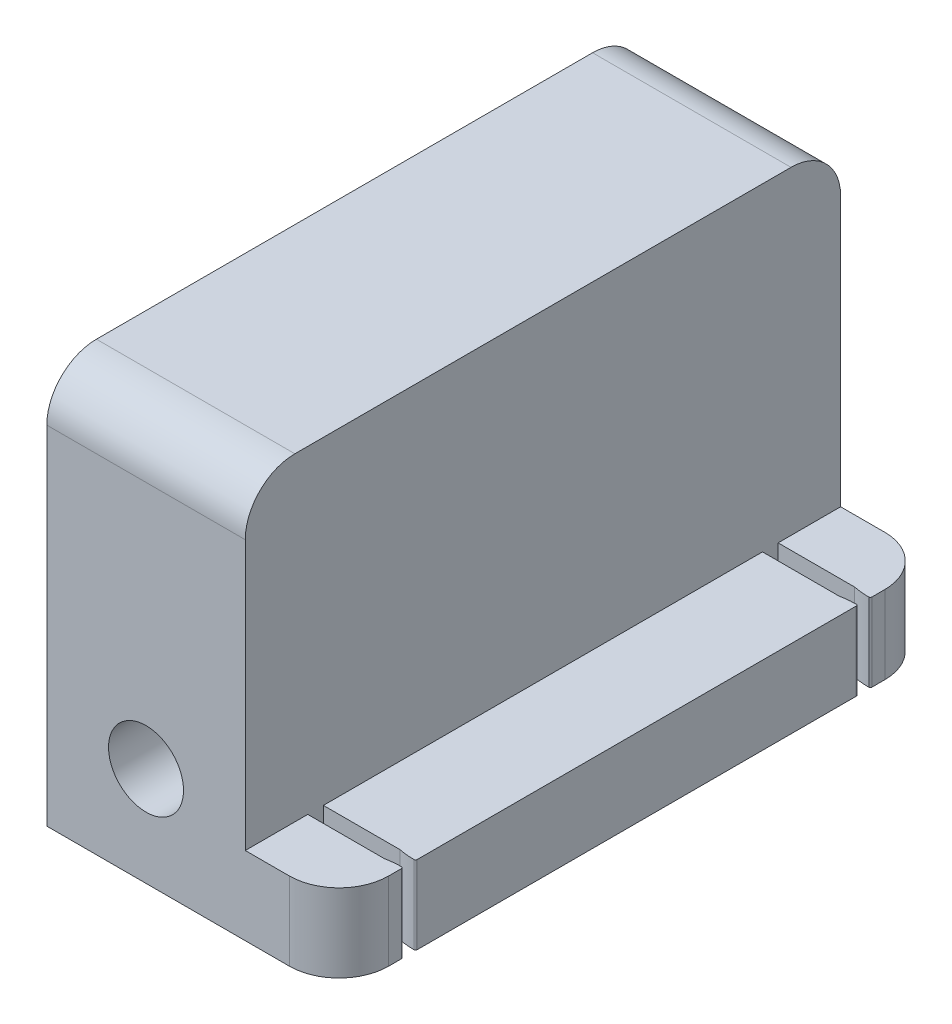
ISO-10303-21;
HEADER;
FILE_DESCRIPTION(('STEP AP214'),'2;1');
FILE_NAME('part.step','',(''),(''),'','','');
FILE_SCHEMA(('AUTOMOTIVE_DESIGN { 1 0 10303 214 1 1 1 1 }'));
ENDSEC;
DATA;
#1=APPLICATION_CONTEXT('core data for automotive mechanical design processes');
#2=APPLICATION_PROTOCOL_DEFINITION('international standard','automotive_design',2000,#1);
#3=PRODUCT_CONTEXT('',#1,'mechanical');
#4=PRODUCT('Part','Part','',(#3));
#5=PRODUCT_RELATED_PRODUCT_CATEGORY('part','',(#4));
#6=PRODUCT_DEFINITION_FORMATION('','',#4);
#7=PRODUCT_DEFINITION_CONTEXT('part definition',#1,'design');
#8=PRODUCT_DEFINITION('design','',#6,#7);
#9=PRODUCT_DEFINITION_SHAPE('','',#8);
#10=(LENGTH_UNIT() NAMED_UNIT(*) SI_UNIT(.MILLI.,.METRE.));
#11=(NAMED_UNIT(*) PLANE_ANGLE_UNIT() SI_UNIT($,.RADIAN.));
#12=(NAMED_UNIT(*) SI_UNIT($,.STERADIAN.) SOLID_ANGLE_UNIT());
#13=UNCERTAINTY_MEASURE_WITH_UNIT(LENGTH_MEASURE(1.E-05),#10,'distance_accuracy_value','');
#14=(GEOMETRIC_REPRESENTATION_CONTEXT(3) GLOBAL_UNCERTAINTY_ASSIGNED_CONTEXT((#13)) GLOBAL_UNIT_ASSIGNED_CONTEXT((#10,
#11,#12)) REPRESENTATION_CONTEXT('',''));
#15=CARTESIAN_POINT('',(0.,0.,0.));
#16=DIRECTION('',(0.,0.,1.));
#17=DIRECTION('',(1.,0.,0.));
#18=AXIS2_PLACEMENT_3D('',#15,#16,#17);
#19=CARTESIAN_POINT('',(-12.7,-25.4,38.1));
#20=DIRECTION('',(0.,1.,0.));
#21=DIRECTION('',(0.,0.,1.));
#22=AXIS2_PLACEMENT_3D('',#19,#20,#21);
#23=PLANE('',#22);
#24=DIRECTION('',(1.,0.,0.));
#25=VECTOR('',#24,1.);
#26=CARTESIAN_POINT('',(-12.7,-25.4,-38.1));
#27=LINE('',#26,#25);
#28=CARTESIAN_POINT('',(-12.7,-25.4,-38.1));
#29=VERTEX_POINT('',#28);
#30=CARTESIAN_POINT('',(18.35,-25.4,-38.1));
#31=VERTEX_POINT('',#30);
#32=EDGE_CURVE('E398',#29,#31,#27,.T.);
#33=ORIENTED_EDGE('',*,*,#32,.T.);
#34=CARTESIAN_POINT('',(18.35,-25.4,-31.75));
#35=DIRECTION('',(0.,1.,0.));
#36=DIRECTION('',(0.,0.,1.));
#37=AXIS2_PLACEMENT_3D('',#34,#35,#36);
#38=CIRCLE('',#37,6.35);
#39=CARTESIAN_POINT('',(24.7,-25.4,-31.75));
#40=VERTEX_POINT('',#39);
#41=EDGE_CURVE('E478',#31,#40,#38,.F.);
#42=ORIENTED_EDGE('',*,*,#41,.T.);
#43=DIRECTION('',(0.,0.,1.));
#44=VECTOR('',#43,1.);
#45=CARTESIAN_POINT('',(24.7,-25.4,38.1));
#46=LINE('',#45,#44);
#47=CARTESIAN_POINT('',(24.7,-25.4,-30.1));
#48=VERTEX_POINT('',#47);
#49=EDGE_CURVE('E365',#40,#48,#46,.T.);
#50=ORIENTED_EDGE('',*,*,#49,.T.);
#51=CARTESIAN_POINT('',(24.5,-25.4,-30.1));
#52=DIRECTION('',(0.,-1.,0.));
#53=DIRECTION('',(0.,0.,-1.));
#54=AXIS2_PLACEMENT_3D('',#51,#52,#53);
#55=CIRCLE('',#54,0.199999999999999);
#56=CARTESIAN_POINT('',(24.5,-25.4,-29.9));
#57=VERTEX_POINT('',#56);
#58=EDGE_CURVE('E240',#48,#57,#55,.T.);
#59=ORIENTED_EDGE('',*,*,#58,.T.);
#60=CARTESIAN_POINT('',(24.5,-25.4,-40.0000000000003));
#61=DIRECTION('',(0.,-1.,0.));
#62=DIRECTION('',(0.,0.,1.));
#63=AXIS2_PLACEMENT_3D('',#60,#61,#62);
#64=CIRCLE('',#63,10.1000000000003);
#65=CARTESIAN_POINT('',(22.5,-25.4,-30.1));
#66=VERTEX_POINT('',#65);
#67=EDGE_CURVE('E256',#57,#66,#64,.T.);
#68=ORIENTED_EDGE('',*,*,#67,.T.);
#69=DIRECTION('',(-1.,0.,0.));
#70=VECTOR('',#69,1.);
#71=CARTESIAN_POINT('',(22.5,-25.4,-30.1));
#72=LINE('',#71,#70);
#73=CARTESIAN_POINT('',(12.7,-25.4,-30.1));
#74=VERTEX_POINT('',#73);
#75=EDGE_CURVE('E260',#66,#74,#72,.T.);
#76=ORIENTED_EDGE('',*,*,#75,.T.);
#77=DIRECTION('',(0.,0.,1.));
#78=VECTOR('',#77,1.);
#79=CARTESIAN_POINT('',(12.7,-25.4,-30.1));
#80=LINE('',#79,#78);
#81=CARTESIAN_POINT('',(12.7,-25.4,-28.1));
#82=VERTEX_POINT('',#81);
#83=EDGE_CURVE('E264',#74,#82,#80,.T.);
#84=ORIENTED_EDGE('',*,*,#83,.T.);
#85=DIRECTION('',(1.,0.,0.));
#86=VECTOR('',#85,1.);
#87=CARTESIAN_POINT('',(12.7,-25.4,-28.1));
#88=LINE('',#87,#86);
#89=CARTESIAN_POINT('',(22.5,-25.4,-28.1));
#90=VERTEX_POINT('',#89);
#91=EDGE_CURVE('E230',#82,#90,#88,.T.);
#92=ORIENTED_EDGE('',*,*,#91,.T.);
#93=CARTESIAN_POINT('',(24.5,-25.4,-18.1999999999997));
#94=DIRECTION('',(0.,-1.,0.));
#95=DIRECTION('',(0.,0.,-1.));
#96=AXIS2_PLACEMENT_3D('',#93,#94,#95);
#97=CIRCLE('',#96,10.1000000000003);
#98=CARTESIAN_POINT('',(24.5,-25.4,-28.3));
#99=VERTEX_POINT('',#98);
#100=EDGE_CURVE('E222',#90,#99,#97,.T.);
#101=ORIENTED_EDGE('',*,*,#100,.T.);
#102=CARTESIAN_POINT('',(24.5,-25.4,-28.1));
#103=DIRECTION('',(0.,-1.,0.));
#104=DIRECTION('',(0.,0.,1.));
#105=AXIS2_PLACEMENT_3D('',#102,#103,#104);
#106=CIRCLE('',#105,0.199999999999999);
#107=CARTESIAN_POINT('',(24.7,-25.4,-28.1));
#108=VERTEX_POINT('',#107);
#109=EDGE_CURVE('E233',#99,#108,#106,.T.);
#110=ORIENTED_EDGE('',*,*,#109,.T.);
#111=CARTESIAN_POINT('',(24.7,-25.4,28.1));
#112=VERTEX_POINT('',#111);
#113=EDGE_CURVE('E368',#108,#112,#46,.T.);
#114=ORIENTED_EDGE('',*,*,#113,.T.);
#115=CARTESIAN_POINT('',(24.5,-25.4,28.1));
#116=DIRECTION('',(0.,-1.,0.));
#117=DIRECTION('',(0.,0.,-1.));
#118=AXIS2_PLACEMENT_3D('',#115,#116,#117);
#119=CIRCLE('',#118,0.199999999999999);
#120=CARTESIAN_POINT('',(24.5,-25.4,28.3));
#121=VERTEX_POINT('',#120);
#122=EDGE_CURVE('E339',#112,#121,#119,.T.);
#123=ORIENTED_EDGE('',*,*,#122,.T.);
#124=CARTESIAN_POINT('',(24.5,-25.4,18.1999999999996));
#125=DIRECTION('',(0.,-1.,0.));
#126=DIRECTION('',(0.,0.,1.));
#127=AXIS2_PLACEMENT_3D('',#124,#125,#126);
#128=CIRCLE('',#127,10.1000000000003);
#129=CARTESIAN_POINT('',(22.5,-25.4,28.1));
#130=VERTEX_POINT('',#129);
#131=EDGE_CURVE('E335',#121,#130,#128,.T.);
#132=ORIENTED_EDGE('',*,*,#131,.T.);
#133=DIRECTION('',(-1.,0.,0.));
#134=VECTOR('',#133,1.);
#135=CARTESIAN_POINT('',(12.7,-25.4,28.1));
#136=LINE('',#135,#134);
#137=CARTESIAN_POINT('',(12.7,-25.4,28.1));
#138=VERTEX_POINT('',#137);
#139=EDGE_CURVE('E331',#130,#138,#136,.T.);
#140=ORIENTED_EDGE('',*,*,#139,.T.);
#141=DIRECTION('',(0.,0.,1.));
#142=VECTOR('',#141,1.);
#143=CARTESIAN_POINT('',(12.7,-25.4,30.1));
#144=LINE('',#143,#142);
#145=CARTESIAN_POINT('',(12.7,-25.4,30.1));
#146=VERTEX_POINT('',#145);
#147=EDGE_CURVE('E327',#138,#146,#144,.T.);
#148=ORIENTED_EDGE('',*,*,#147,.T.);
#149=DIRECTION('',(1.,0.,0.));
#150=VECTOR('',#149,1.);
#151=CARTESIAN_POINT('',(22.5,-25.4,30.1));
#152=LINE('',#151,#150);
#153=CARTESIAN_POINT('',(22.5,-25.4,30.1));
#154=VERTEX_POINT('',#153);
#155=EDGE_CURVE('E297',#146,#154,#152,.T.);
#156=ORIENTED_EDGE('',*,*,#155,.T.);
#157=CARTESIAN_POINT('',(24.5,-25.4,40.0000000000003));
#158=DIRECTION('',(0.,-1.,0.));
#159=DIRECTION('',(0.,0.,-1.));
#160=AXIS2_PLACEMENT_3D('',#157,#158,#159);
#161=CIRCLE('',#160,10.1000000000003);
#162=CARTESIAN_POINT('',(24.5,-25.4,29.9));
#163=VERTEX_POINT('',#162);
#164=EDGE_CURVE('E246',#154,#163,#161,.T.);
#165=ORIENTED_EDGE('',*,*,#164,.T.);
#166=CARTESIAN_POINT('',(24.5,-25.4,30.1));
#167=DIRECTION('',(0.,-1.,0.));
#168=DIRECTION('',(0.,0.,1.));
#169=AXIS2_PLACEMENT_3D('',#166,#167,#168);
#170=CIRCLE('',#169,0.199999999999999);
#171=CARTESIAN_POINT('',(24.7,-25.4,30.1));
#172=VERTEX_POINT('',#171);
#173=EDGE_CURVE('E250',#163,#172,#170,.T.);
#174=ORIENTED_EDGE('',*,*,#173,.T.);
#175=CARTESIAN_POINT('',(24.7,-25.4,31.75));
#176=VERTEX_POINT('',#175);
#177=EDGE_CURVE('E272',#172,#176,#46,.T.);
#178=ORIENTED_EDGE('',*,*,#177,.T.);
#179=CARTESIAN_POINT('',(18.35,-25.4,31.75));
#180=DIRECTION('',(0.,1.,0.));
#181=DIRECTION('',(0.,0.,1.));
#182=AXIS2_PLACEMENT_3D('',#179,#180,#181);
#183=CIRCLE('',#182,6.35);
#184=CARTESIAN_POINT('',(18.35,-25.4,38.1));
#185=VERTEX_POINT('',#184);
#186=EDGE_CURVE('E475',#176,#185,#183,.F.);
#187=ORIENTED_EDGE('',*,*,#186,.T.);
#188=DIRECTION('',(1.,0.,0.));
#189=VECTOR('',#188,1.);
#190=CARTESIAN_POINT('',(-12.7,-25.4,38.1));
#191=LINE('',#190,#189);
#192=CARTESIAN_POINT('',(-12.7,-25.4,38.1));
#193=VERTEX_POINT('',#192);
#194=EDGE_CURVE('E401',#193,#185,#191,.T.);
#195=ORIENTED_EDGE('',*,*,#194,.F.);
#196=DIRECTION('',(0.,0.,-1.));
#197=VECTOR('',#196,1.);
#198=CARTESIAN_POINT('',(-12.7,-25.4,38.1));
#199=LINE('',#198,#197);
#200=EDGE_CURVE('E405',#193,#29,#199,.T.);
#201=ORIENTED_EDGE('',*,*,#200,.T.);
#202=EDGE_LOOP('',(#33,#42,#50,#59,#68,#76,#84,#92,#101,#110,#114,#123,#132,#140,#148,#156,#165,
#174,#178,#187,#195,#201));
#203=FACE_BOUND('',#202,.T.);
#204=ADVANCED_FACE('F43',(#203),#23,.F.);
#205=CARTESIAN_POINT('',(24.7,-15.4,38.1));
#206=DIRECTION('',(1.,0.,0.));
#207=DIRECTION('',(0.,0.,-1.));
#208=AXIS2_PLACEMENT_3D('',#205,#206,#207);
#209=PLANE('',#208);
#210=ORIENTED_EDGE('',*,*,#49,.F.);
#211=DIRECTION('',(0.,-1.,0.));
#212=VECTOR('',#211,1.);
#213=CARTESIAN_POINT('',(24.7,-15.4,-31.75));
#214=LINE('',#213,#212);
#215=CARTESIAN_POINT('',(24.7,-15.4,-31.75));
#216=VERTEX_POINT('',#215);
#217=EDGE_CURVE('E481',#40,#216,#214,.F.);
#218=ORIENTED_EDGE('',*,*,#217,.T.);
#219=DIRECTION('',(0.,0.,1.));
#220=VECTOR('',#219,1.);
#221=CARTESIAN_POINT('',(24.7,-15.4,38.1));
#222=LINE('',#221,#220);
#223=CARTESIAN_POINT('',(24.7,-15.4,-30.1));
#224=VERTEX_POINT('',#223);
#225=EDGE_CURVE('E346',#216,#224,#222,.T.);
#226=ORIENTED_EDGE('',*,*,#225,.T.);
#227=DIRECTION('',(0.,1.,0.));
#228=VECTOR('',#227,1.);
#229=CARTESIAN_POINT('',(24.7,-25.4,-30.1));
#230=LINE('',#229,#228);
#231=EDGE_CURVE('E288',#48,#224,#230,.T.);
#232=ORIENTED_EDGE('',*,*,#231,.F.);
#233=EDGE_LOOP('',(#210,#218,#226,#232));
#234=FACE_BOUND('',#233,.T.);
#235=ADVANCED_FACE('F599',(#234),#209,.T.);
#236=DIRECTION('',(0.,1.,0.));
#237=VECTOR('',#236,1.);
#238=CARTESIAN_POINT('',(24.7,-25.4,-28.1));
#239=LINE('',#238,#237);
#240=CARTESIAN_POINT('',(24.7,-15.4,-28.1));
#241=VERTEX_POINT('',#240);
#242=EDGE_CURVE('E229',#108,#241,#239,.T.);
#243=ORIENTED_EDGE('',*,*,#242,.T.);
#244=CARTESIAN_POINT('',(24.7,-15.4,28.1));
#245=VERTEX_POINT('',#244);
#246=EDGE_CURVE('E350',#241,#245,#222,.T.);
#247=ORIENTED_EDGE('',*,*,#246,.T.);
#248=DIRECTION('',(0.,1.,0.));
#249=VECTOR('',#248,1.);
#250=CARTESIAN_POINT('',(24.7,-25.4,28.1));
#251=LINE('',#250,#249);
#252=EDGE_CURVE('E302',#112,#245,#251,.T.);
#253=ORIENTED_EDGE('',*,*,#252,.F.);
#254=ORIENTED_EDGE('',*,*,#113,.F.);
#255=EDGE_LOOP('',(#243,#247,#253,#254));
#256=FACE_BOUND('',#255,.T.);
#257=ADVANCED_FACE('F560',(#256),#209,.T.);
#258=CARTESIAN_POINT('',(0.,-15.4,0.));
#259=DIRECTION('',(0.,-1.,0.));
#260=DIRECTION('',(0.,0.,-1.));
#261=AXIS2_PLACEMENT_3D('',#258,#259,#260);
#262=PLANE('',#261);
#263=ORIENTED_EDGE('',*,*,#225,.F.);
#264=CARTESIAN_POINT('',(18.35,-15.4,-31.75));
#265=DIRECTION('',(0.,-1.,0.));
#266=DIRECTION('',(0.,0.,-1.));
#267=AXIS2_PLACEMENT_3D('',#264,#265,#266);
#268=CIRCLE('',#267,6.35);
#269=CARTESIAN_POINT('',(18.35,-15.4,-38.1));
#270=VERTEX_POINT('',#269);
#271=EDGE_CURVE('E484',#216,#270,#268,.F.);
#272=ORIENTED_EDGE('',*,*,#271,.T.);
#273=DIRECTION('',(1.,0.,0.));
#274=VECTOR('',#273,1.);
#275=CARTESIAN_POINT('',(12.7,-15.4,-38.1));
#276=LINE('',#275,#274);
#277=CARTESIAN_POINT('',(12.7,-15.4,-38.1));
#278=VERTEX_POINT('',#277);
#279=EDGE_CURVE('E359',#278,#270,#276,.T.);
#280=ORIENTED_EDGE('',*,*,#279,.F.);
#281=DIRECTION('',(0.,0.,-1.));
#282=VECTOR('',#281,1.);
#283=CARTESIAN_POINT('',(12.7,-15.4,38.1));
#284=LINE('',#283,#282);
#285=CARTESIAN_POINT('',(12.7,-15.4,-30.1));
#286=VERTEX_POINT('',#285);
#287=EDGE_CURVE('E354',#286,#278,#284,.T.);
#288=ORIENTED_EDGE('',*,*,#287,.F.);
#289=DIRECTION('',(1.,0.,0.));
#290=VECTOR('',#289,1.);
#291=CARTESIAN_POINT('',(0.,-15.4,-30.1));
#292=LINE('',#291,#290);
#293=CARTESIAN_POINT('',(22.5,-15.4,-30.1));
#294=VERTEX_POINT('',#293);
#295=EDGE_CURVE('E464',#286,#294,#292,.T.);
#296=ORIENTED_EDGE('',*,*,#295,.T.);
#297=CARTESIAN_POINT('',(24.5,-15.4,-40.0000000000003));
#298=DIRECTION('',(0.,-1.,0.));
#299=DIRECTION('',(0.,0.,-1.));
#300=AXIS2_PLACEMENT_3D('',#297,#298,#299);
#301=CIRCLE('',#300,10.1000000000003);
#302=CARTESIAN_POINT('',(24.5,-15.4,-29.9));
#303=VERTEX_POINT('',#302);
#304=EDGE_CURVE('E460',#294,#303,#301,.F.);
#305=ORIENTED_EDGE('',*,*,#304,.T.);
#306=CARTESIAN_POINT('',(24.5,-15.4,-30.1));
#307=DIRECTION('',(0.,-1.,0.));
#308=DIRECTION('',(0.,0.,-1.));
#309=AXIS2_PLACEMENT_3D('',#306,#307,#308);
#310=CIRCLE('',#309,0.199999999999999);
#311=EDGE_CURVE('E456',#303,#224,#310,.F.);
#312=ORIENTED_EDGE('',*,*,#311,.T.);
#313=EDGE_LOOP('',(#263,#272,#280,#288,#296,#305,#312));
#314=FACE_BOUND('',#313,.T.);
#315=ADVANCED_FACE('F593',(#314),#262,.F.);
#316=CARTESIAN_POINT('',(24.5,-15.4,-18.1999999999997));
#317=DIRECTION('',(0.,-1.,0.));
#318=DIRECTION('',(0.,0.,-1.));
#319=AXIS2_PLACEMENT_3D('',#316,#317,#318);
#320=CIRCLE('',#319,10.1000000000003);
#321=CARTESIAN_POINT('',(24.5,-15.4,-28.3));
#322=VERTEX_POINT('',#321);
#323=CARTESIAN_POINT('',(22.5,-15.4,-28.1));
#324=VERTEX_POINT('',#323);
#325=EDGE_CURVE('E225',#322,#324,#320,.F.);
#326=ORIENTED_EDGE('',*,*,#325,.T.);
#327=DIRECTION('',(-1.,0.,0.));
#328=VECTOR('',#327,1.);
#329=CARTESIAN_POINT('',(0.,-15.4,-28.1));
#330=LINE('',#329,#328);
#331=CARTESIAN_POINT('',(12.7,-15.4,-28.1));
#332=VERTEX_POINT('',#331);
#333=EDGE_CURVE('E452',#324,#332,#330,.T.);
#334=ORIENTED_EDGE('',*,*,#333,.T.);
#335=CARTESIAN_POINT('',(12.7,-15.4,28.1));
#336=VERTEX_POINT('',#335);
#337=EDGE_CURVE('E360',#336,#332,#284,.T.);
#338=ORIENTED_EDGE('',*,*,#337,.F.);
#339=DIRECTION('',(1.,0.,0.));
#340=VECTOR('',#339,1.);
#341=CARTESIAN_POINT('',(0.,-15.4,28.1));
#342=LINE('',#341,#340);
#343=CARTESIAN_POINT('',(22.5,-15.4,28.1));
#344=VERTEX_POINT('',#343);
#345=EDGE_CURVE('E443',#336,#344,#342,.T.);
#346=ORIENTED_EDGE('',*,*,#345,.T.);
#347=CARTESIAN_POINT('',(24.5,-15.4,18.1999999999996));
#348=DIRECTION('',(0.,-1.,0.));
#349=DIRECTION('',(0.,0.,-1.));
#350=AXIS2_PLACEMENT_3D('',#347,#348,#349);
#351=CIRCLE('',#350,10.1000000000003);
#352=CARTESIAN_POINT('',(24.5,-15.4,28.3));
#353=VERTEX_POINT('',#352);
#354=EDGE_CURVE('E439',#344,#353,#351,.F.);
#355=ORIENTED_EDGE('',*,*,#354,.T.);
#356=CARTESIAN_POINT('',(24.5,-15.4,28.1));
#357=DIRECTION('',(0.,-1.,0.));
#358=DIRECTION('',(0.,0.,-1.));
#359=AXIS2_PLACEMENT_3D('',#356,#357,#358);
#360=CIRCLE('',#359,0.199999999999999);
#361=EDGE_CURVE('E435',#353,#245,#360,.F.);
#362=ORIENTED_EDGE('',*,*,#361,.T.);
#363=ORIENTED_EDGE('',*,*,#246,.F.);
#364=CARTESIAN_POINT('',(24.5,-15.4,-28.1));
#365=DIRECTION('',(0.,-1.,0.));
#366=DIRECTION('',(0.,0.,-1.));
#367=AXIS2_PLACEMENT_3D('',#364,#365,#366);
#368=CIRCLE('',#367,0.199999999999999);
#369=EDGE_CURVE('E447',#241,#322,#368,.F.);
#370=ORIENTED_EDGE('',*,*,#369,.T.);
#371=EDGE_LOOP('',(#326,#334,#338,#346,#355,#362,#363,#370));
#372=FACE_BOUND('',#371,.T.);
#373=ADVANCED_FACE('F562',(#372),#262,.F.);
#374=DIRECTION('',(-1.,0.,0.));
#375=VECTOR('',#374,1.);
#376=CARTESIAN_POINT('',(12.7,-15.4,38.1));
#377=LINE('',#376,#375);
#378=CARTESIAN_POINT('',(18.35,-15.4,38.1));
#379=VERTEX_POINT('',#378);
#380=CARTESIAN_POINT('',(12.7,-15.4,38.1));
#381=VERTEX_POINT('',#380);
#382=EDGE_CURVE('E349',#379,#381,#377,.T.);
#383=ORIENTED_EDGE('',*,*,#382,.F.);
#384=CARTESIAN_POINT('',(18.35,-15.4,31.75));
#385=DIRECTION('',(0.,-1.,0.));
#386=DIRECTION('',(0.,0.,-1.));
#387=AXIS2_PLACEMENT_3D('',#384,#385,#386);
#388=CIRCLE('',#387,6.35);
#389=CARTESIAN_POINT('',(24.7,-15.4,31.75));
#390=VERTEX_POINT('',#389);
#391=EDGE_CURVE('E498',#379,#390,#388,.F.);
#392=ORIENTED_EDGE('',*,*,#391,.T.);
#393=CARTESIAN_POINT('',(24.7,-15.4,30.1));
#394=VERTEX_POINT('',#393);
#395=EDGE_CURVE('E351',#394,#390,#222,.T.);
#396=ORIENTED_EDGE('',*,*,#395,.F.);
#397=CARTESIAN_POINT('',(24.5,-15.4,30.1));
#398=DIRECTION('',(0.,-1.,0.));
#399=DIRECTION('',(0.,0.,-1.));
#400=AXIS2_PLACEMENT_3D('',#397,#398,#399);
#401=CIRCLE('',#400,0.199999999999999);
#402=CARTESIAN_POINT('',(24.5,-15.4,29.9));
#403=VERTEX_POINT('',#402);
#404=EDGE_CURVE('E423',#394,#403,#401,.F.);
#405=ORIENTED_EDGE('',*,*,#404,.T.);
#406=CARTESIAN_POINT('',(24.5,-15.4,40.0000000000003));
#407=DIRECTION('',(0.,-1.,0.));
#408=DIRECTION('',(0.,0.,-1.));
#409=AXIS2_PLACEMENT_3D('',#406,#407,#408);
#410=CIRCLE('',#409,10.1000000000003);
#411=CARTESIAN_POINT('',(22.5,-15.4,30.1));
#412=VERTEX_POINT('',#411);
#413=EDGE_CURVE('E427',#403,#412,#410,.F.);
#414=ORIENTED_EDGE('',*,*,#413,.T.);
#415=DIRECTION('',(-1.,0.,0.));
#416=VECTOR('',#415,1.);
#417=CARTESIAN_POINT('',(0.,-15.4,30.1));
#418=LINE('',#417,#416);
#419=CARTESIAN_POINT('',(12.7,-15.4,30.1));
#420=VERTEX_POINT('',#419);
#421=EDGE_CURVE('E431',#412,#420,#418,.T.);
#422=ORIENTED_EDGE('',*,*,#421,.T.);
#423=EDGE_CURVE('E355',#381,#420,#284,.T.);
#424=ORIENTED_EDGE('',*,*,#423,.F.);
#425=EDGE_LOOP('',(#383,#392,#396,#405,#414,#422,#424));
#426=FACE_BOUND('',#425,.T.);
#427=ADVANCED_FACE('F550',(#426),#262,.F.);
#428=CARTESIAN_POINT('',(0.,0.,38.1));
#429=DIRECTION('',(0.,0.,-1.));
#430=DIRECTION('',(-1.,0.,0.));
#431=AXIS2_PLACEMENT_3D('',#428,#429,#430);
#432=PLANE('',#431);
#433=ORIENTED_EDGE('',*,*,#194,.T.);
#434=DIRECTION('',(0.,-1.,0.));
#435=VECTOR('',#434,1.);
#436=CARTESIAN_POINT('',(18.35,-15.4,38.1));
#437=LINE('',#436,#435);
#438=EDGE_CURVE('E495',#185,#379,#437,.F.);
#439=ORIENTED_EDGE('',*,*,#438,.T.);
#440=ORIENTED_EDGE('',*,*,#382,.T.);
#441=DIRECTION('',(0.,1.,0.));
#442=VECTOR('',#441,1.);
#443=CARTESIAN_POINT('',(12.7,-25.4,38.1));
#444=LINE('',#443,#442);
#445=CARTESIAN_POINT('',(12.7,19.05,38.1));
#446=VERTEX_POINT('',#445);
#447=EDGE_CURVE('E393',#381,#446,#444,.T.);
#448=ORIENTED_EDGE('',*,*,#447,.T.);
#449=DIRECTION('',(-1.,0.,0.));
#450=VECTOR('',#449,1.);
#451=CARTESIAN_POINT('',(0.,19.05,38.1));
#452=LINE('',#451,#450);
#453=CARTESIAN_POINT('',(-12.7,19.05,38.1));
#454=VERTEX_POINT('',#453);
#455=EDGE_CURVE('E491',#446,#454,#452,.T.);
#456=ORIENTED_EDGE('',*,*,#455,.T.);
#457=DIRECTION('',(0.,-1.,0.));
#458=VECTOR('',#457,1.);
#459=CARTESIAN_POINT('',(-12.7,-25.4,38.1));
#460=LINE('',#459,#458);
#461=EDGE_CURVE('E397',#454,#193,#460,.T.);
#462=ORIENTED_EDGE('',*,*,#461,.T.);
#463=EDGE_LOOP('',(#433,#439,#440,#448,#456,#462));
#464=FACE_BOUND('',#463,.T.);
#465=CARTESIAN_POINT('',(0.,-12.7,38.1));
#466=DIRECTION('',(0.,0.,1.));
#467=DIRECTION('',(1.,0.,0.));
#468=AXIS2_PLACEMENT_3D('',#465,#466,#467);
#469=CIRCLE('',#468,4.8006);
#470=CARTESIAN_POINT('',(-4.8006,-12.7,38.1));
#471=VERTEX_POINT('',#470);
#472=EDGE_CURVE('E385',#471,#471,#469,.T.);
#473=ORIENTED_EDGE('',*,*,#472,.F.);
#474=EDGE_LOOP('',(#473));
#475=FACE_BOUND('',#474,.T.);
#476=ADVANCED_FACE('F519',(#464,#475),#432,.F.);
#477=CARTESIAN_POINT('',(0.,0.,-38.1));
#478=DIRECTION('',(0.,0.,-1.));
#479=DIRECTION('',(-1.,0.,0.));
#480=AXIS2_PLACEMENT_3D('',#477,#478,#479);
#481=PLANE('',#480);
#482=ORIENTED_EDGE('',*,*,#279,.T.);
#483=DIRECTION('',(0.,-1.,0.));
#484=VECTOR('',#483,1.);
#485=CARTESIAN_POINT('',(18.35,0.,-38.1));
#486=LINE('',#485,#484);
#487=EDGE_CURVE('E471',#270,#31,#486,.T.);
#488=ORIENTED_EDGE('',*,*,#487,.T.);
#489=ORIENTED_EDGE('',*,*,#32,.F.);
#490=DIRECTION('',(0.,-1.,0.));
#491=VECTOR('',#490,1.);
#492=CARTESIAN_POINT('',(-12.7,-25.4,-38.1));
#493=LINE('',#492,#491);
#494=CARTESIAN_POINT('',(-12.7,19.05,-38.1));
#495=VERTEX_POINT('',#494);
#496=EDGE_CURVE('E408',#495,#29,#493,.T.);
#497=ORIENTED_EDGE('',*,*,#496,.F.);
#498=DIRECTION('',(-1.,0.,0.));
#499=VECTOR('',#498,1.);
#500=CARTESIAN_POINT('',(12.7,19.05,-38.1));
#501=LINE('',#500,#499);
#502=CARTESIAN_POINT('',(12.7,19.05,-38.1));
#503=VERTEX_POINT('',#502);
#504=EDGE_CURVE('E468',#495,#503,#501,.F.);
#505=ORIENTED_EDGE('',*,*,#504,.T.);
#506=DIRECTION('',(0.,1.,0.));
#507=VECTOR('',#506,1.);
#508=CARTESIAN_POINT('',(12.7,-25.4,-38.1));
#509=LINE('',#508,#507);
#510=EDGE_CURVE('E389',#278,#503,#509,.T.);
#511=ORIENTED_EDGE('',*,*,#510,.F.);
#512=EDGE_LOOP('',(#482,#488,#489,#497,#505,#511));
#513=FACE_BOUND('',#512,.T.);
#514=CARTESIAN_POINT('',(0.,-12.7,-38.1));
#515=DIRECTION('',(0.,0.,1.));
#516=DIRECTION('',(1.,0.,0.));
#517=AXIS2_PLACEMENT_3D('',#514,#515,#516);
#518=CIRCLE('',#517,4.8006);
#519=CARTESIAN_POINT('',(-4.8006,-12.7,-38.1));
#520=VERTEX_POINT('',#519);
#521=EDGE_CURVE('E373',#520,#520,#518,.T.);
#522=ORIENTED_EDGE('',*,*,#521,.T.);
#523=EDGE_LOOP('',(#522));
#524=FACE_BOUND('',#523,.T.);
#525=ADVANCED_FACE('F535',(#513,#524),#481,.T.);
#526=CARTESIAN_POINT('',(12.7,-25.4,38.1));
#527=DIRECTION('',(-1.,0.,0.));
#528=DIRECTION('',(0.,0.,1.));
#529=AXIS2_PLACEMENT_3D('',#526,#527,#528);
#530=PLANE('',#529);
#531=ORIENTED_EDGE('',*,*,#510,.T.);
#532=CARTESIAN_POINT('',(12.7,19.05,-31.75));
#533=DIRECTION('',(-1.,0.,0.));
#534=DIRECTION('',(0.,0.,1.));
#535=AXIS2_PLACEMENT_3D('',#532,#533,#534);
#536=CIRCLE('',#535,6.35);
#537=CARTESIAN_POINT('',(12.7,25.4,-31.75));
#538=VERTEX_POINT('',#537);
#539=EDGE_CURVE('E11',#503,#538,#536,.F.);
#540=ORIENTED_EDGE('',*,*,#539,.T.);
#541=DIRECTION('',(0.,0.,-1.));
#542=VECTOR('',#541,1.);
#543=CARTESIAN_POINT('',(12.7,25.4,38.1));
#544=LINE('',#543,#542);
#545=CARTESIAN_POINT('',(12.7,25.4,31.75));
#546=VERTEX_POINT('',#545);
#547=EDGE_CURVE('E420',#546,#538,#544,.T.);
#548=ORIENTED_EDGE('',*,*,#547,.F.);
#549=CARTESIAN_POINT('',(12.7,19.05,31.75));
#550=DIRECTION('',(-1.,0.,0.));
#551=DIRECTION('',(0.,0.,1.));
#552=AXIS2_PLACEMENT_3D('',#549,#550,#551);
#553=CIRCLE('',#552,6.35);
#554=EDGE_CURVE('E52',#546,#446,#553,.F.);
#555=ORIENTED_EDGE('',*,*,#554,.T.);
#556=ORIENTED_EDGE('',*,*,#447,.F.);
#557=ORIENTED_EDGE('',*,*,#423,.T.);
#558=DIRECTION('',(0.,1.,0.));
#559=VECTOR('',#558,1.);
#560=CARTESIAN_POINT('',(12.7,-25.4,30.1));
#561=LINE('',#560,#559);
#562=EDGE_CURVE('E317',#146,#420,#561,.T.);
#563=ORIENTED_EDGE('',*,*,#562,.F.);
#564=ORIENTED_EDGE('',*,*,#147,.F.);
#565=DIRECTION('',(0.,1.,0.));
#566=VECTOR('',#565,1.);
#567=CARTESIAN_POINT('',(12.7,-25.4,28.1));
#568=LINE('',#567,#566);
#569=EDGE_CURVE('E313',#138,#336,#568,.T.);
#570=ORIENTED_EDGE('',*,*,#569,.T.);
#571=ORIENTED_EDGE('',*,*,#337,.T.);
#572=DIRECTION('',(0.,1.,0.));
#573=VECTOR('',#572,1.);
#574=CARTESIAN_POINT('',(12.7,-25.4,-28.1));
#575=LINE('',#574,#573);
#576=EDGE_CURVE('E273',#82,#332,#575,.T.);
#577=ORIENTED_EDGE('',*,*,#576,.F.);
#578=ORIENTED_EDGE('',*,*,#83,.F.);
#579=DIRECTION('',(0.,1.,0.));
#580=VECTOR('',#579,1.);
#581=CARTESIAN_POINT('',(12.7,-25.4,-30.1));
#582=LINE('',#581,#580);
#583=EDGE_CURVE('E276',#74,#286,#582,.T.);
#584=ORIENTED_EDGE('',*,*,#583,.T.);
#585=ORIENTED_EDGE('',*,*,#287,.T.);
#586=EDGE_LOOP('',(#531,#540,#548,#555,#556,#557,#563,#564,#570,#571,#577,#578,#584,#585));
#587=FACE_BOUND('',#586,.T.);
#588=ADVANCED_FACE('F515',(#587),#530,.F.);
#589=CARTESIAN_POINT('',(-12.7,25.4,38.1));
#590=DIRECTION('',(0.,-1.,0.));
#591=DIRECTION('',(0.,0.,-1.));
#592=AXIS2_PLACEMENT_3D('',#589,#590,#591);
#593=PLANE('',#592);
#594=ORIENTED_EDGE('',*,*,#547,.T.);
#595=DIRECTION('',(-1.,0.,0.));
#596=VECTOR('',#595,1.);
#597=CARTESIAN_POINT('',(-12.7,25.4,-31.75));
#598=LINE('',#597,#596);
#599=CARTESIAN_POINT('',(-12.7,25.4,-31.75));
#600=VERTEX_POINT('',#599);
#601=EDGE_CURVE('E503',#538,#600,#598,.T.);
#602=ORIENTED_EDGE('',*,*,#601,.T.);
#603=DIRECTION('',(0.,0.,-1.));
#604=VECTOR('',#603,1.);
#605=CARTESIAN_POINT('',(-12.7,25.4,38.1));
#606=LINE('',#605,#604);
#607=CARTESIAN_POINT('',(-12.7,25.4,31.75));
#608=VERTEX_POINT('',#607);
#609=EDGE_CURVE('E416',#608,#600,#606,.T.);
#610=ORIENTED_EDGE('',*,*,#609,.F.);
#611=DIRECTION('',(-1.,0.,0.));
#612=VECTOR('',#611,1.);
#613=CARTESIAN_POINT('',(-12.7,25.4,31.75));
#614=LINE('',#613,#612);
#615=EDGE_CURVE('E64',#608,#546,#614,.F.);
#616=ORIENTED_EDGE('',*,*,#615,.T.);
#617=EDGE_LOOP('',(#594,#602,#610,#616));
#618=FACE_BOUND('',#617,.T.);
#619=ADVANCED_FACE('F527',(#618),#593,.F.);
#620=CARTESIAN_POINT('',(-12.7,-25.4,38.1));
#621=DIRECTION('',(1.,0.,0.));
#622=DIRECTION('',(0.,1.,0.));
#623=AXIS2_PLACEMENT_3D('',#620,#621,#622);
#624=PLANE('',#623);
#625=CARTESIAN_POINT('',(-12.7,12.7,25.4));
#626=DIRECTION('',(1.,0.,0.));
#627=DIRECTION('',(0.,0.,-1.));
#628=AXIS2_PLACEMENT_3D('',#625,#626,#627);
#629=CIRCLE('',#628,4.8006);
#630=CARTESIAN_POINT('',(-12.7,12.7,20.5994));
#631=VERTEX_POINT('',#630);
#632=EDGE_CURVE('E369',#631,#631,#629,.T.);
#633=ORIENTED_EDGE('',*,*,#632,.T.);
#634=EDGE_LOOP('',(#633));
#635=FACE_BOUND('',#634,.T.);
#636=CARTESIAN_POINT('',(-12.7,12.7,-25.4));
#637=DIRECTION('',(1.,0.,0.));
#638=DIRECTION('',(0.,0.,1.));
#639=AXIS2_PLACEMENT_3D('',#636,#637,#638);
#640=CIRCLE('',#639,4.8006);
#641=CARTESIAN_POINT('',(-12.7,12.7,-20.5994));
#642=VERTEX_POINT('',#641);
#643=EDGE_CURVE('E364',#642,#642,#640,.T.);
#644=ORIENTED_EDGE('',*,*,#643,.T.);
#645=EDGE_LOOP('',(#644));
#646=FACE_BOUND('',#645,.T.);
#647=ORIENTED_EDGE('',*,*,#609,.T.);
#648=CARTESIAN_POINT('',(-12.7,19.05,-31.75));
#649=DIRECTION('',(1.,0.,0.));
#650=DIRECTION('',(0.,1.,0.));
#651=AXIS2_PLACEMENT_3D('',#648,#649,#650);
#652=CIRCLE('',#651,6.35);
#653=EDGE_CURVE('E510',#600,#495,#652,.F.);
#654=ORIENTED_EDGE('',*,*,#653,.T.);
#655=ORIENTED_EDGE('',*,*,#496,.T.);
#656=ORIENTED_EDGE('',*,*,#200,.F.);
#657=ORIENTED_EDGE('',*,*,#461,.F.);
#658=CARTESIAN_POINT('',(-12.7,19.05,31.75));
#659=DIRECTION('',(1.,0.,0.));
#660=DIRECTION('',(0.,1.,0.));
#661=AXIS2_PLACEMENT_3D('',#658,#659,#660);
#662=CIRCLE('',#661,6.35);
#663=EDGE_CURVE('E507',#454,#608,#662,.F.);
#664=ORIENTED_EDGE('',*,*,#663,.T.);
#665=EDGE_LOOP('',(#647,#654,#655,#656,#657,#664));
#666=FACE_BOUND('',#665,.T.);
#667=ADVANCED_FACE('F525',(#635,#646,#666),#624,.F.);
#668=CARTESIAN_POINT('',(0.,-12.7,38.1));
#669=DIRECTION('',(0.,0.,-1.));
#670=DIRECTION('',(-1.,0.,0.));
#671=AXIS2_PLACEMENT_3D('',#668,#669,#670);
#672=CYLINDRICAL_SURFACE('',#671,4.8006);
#673=CARTESIAN_POINT('',(-4.8006,-12.7,38.1));
#674=CARTESIAN_POINT('',(-4.8006,-12.7,37.30625));
#675=CARTESIAN_POINT('',(-4.8006,-12.7,36.5125));
#676=CARTESIAN_POINT('',(-4.8006,-12.7,34.925));
#677=CARTESIAN_POINT('',(-4.8006,-12.7,34.13125));
#678=CARTESIAN_POINT('',(-4.8006,-12.7,32.54375));
#679=CARTESIAN_POINT('',(-4.8006,-12.7,31.75));
#680=CARTESIAN_POINT('',(-4.8006,-12.7,30.1625));
#681=CARTESIAN_POINT('',(-4.8006,-12.7,29.36875));
#682=CARTESIAN_POINT('',(-4.8006,-12.7,27.78125));
#683=CARTESIAN_POINT('',(-4.8006,-12.7,26.9875));
#684=CARTESIAN_POINT('',(-4.8006,-12.7,25.4));
#685=CARTESIAN_POINT('',(-4.8006,-12.7,24.60625));
#686=CARTESIAN_POINT('',(-4.8006,-12.7,23.01875));
#687=CARTESIAN_POINT('',(-4.8006,-12.7,22.225));
#688=CARTESIAN_POINT('',(-4.8006,-12.7,20.6375));
#689=CARTESIAN_POINT('',(-4.8006,-12.7,19.84375));
#690=CARTESIAN_POINT('',(-4.8006,-12.7,18.25625));
#691=CARTESIAN_POINT('',(-4.8006,-12.7,17.4625));
#692=CARTESIAN_POINT('',(-4.8006,-12.7,15.875));
#693=CARTESIAN_POINT('',(-4.8006,-12.7,15.08125));
#694=CARTESIAN_POINT('',(-4.8006,-12.7,13.49375));
#695=CARTESIAN_POINT('',(-4.8006,-12.7,12.7));
#696=CARTESIAN_POINT('',(-4.8006,-12.7,11.1125));
#697=CARTESIAN_POINT('',(-4.8006,-12.7,10.31875));
#698=CARTESIAN_POINT('',(-4.8006,-12.7,8.73124999999999));
#699=CARTESIAN_POINT('',(-4.8006,-12.7,7.93749999999999));
#700=CARTESIAN_POINT('',(-4.8006,-12.7,6.35));
#701=CARTESIAN_POINT('',(-4.8006,-12.7,5.55625));
#702=CARTESIAN_POINT('',(-4.8006,-12.7,3.96875));
#703=CARTESIAN_POINT('',(-4.8006,-12.7,3.175));
#704=CARTESIAN_POINT('',(-4.8006,-12.7,1.5875));
#705=CARTESIAN_POINT('',(-4.8006,-12.7,0.793750000000001));
#706=CARTESIAN_POINT('',(-4.8006,-12.7,-0.793750000000001));
#707=CARTESIAN_POINT('',(-4.8006,-12.7,-1.5875));
#708=CARTESIAN_POINT('',(-4.8006,-12.7,-3.175));
#709=CARTESIAN_POINT('',(-4.8006,-12.7,-3.96875));
#710=CARTESIAN_POINT('',(-4.8006,-12.7,-5.55625));
#711=CARTESIAN_POINT('',(-4.8006,-12.7,-6.35));
#712=CARTESIAN_POINT('',(-4.8006,-12.7,-7.93750000000001));
#713=CARTESIAN_POINT('',(-4.8006,-12.7,-8.73125));
#714=CARTESIAN_POINT('',(-4.8006,-12.7,-10.31875));
#715=CARTESIAN_POINT('',(-4.8006,-12.7,-11.1125));
#716=CARTESIAN_POINT('',(-4.8006,-12.7,-12.7));
#717=CARTESIAN_POINT('',(-4.8006,-12.7,-13.49375));
#718=CARTESIAN_POINT('',(-4.8006,-12.7,-15.08125));
#719=CARTESIAN_POINT('',(-4.8006,-12.7,-15.875));
#720=CARTESIAN_POINT('',(-4.8006,-12.7,-17.4625));
#721=CARTESIAN_POINT('',(-4.8006,-12.7,-18.25625));
#722=CARTESIAN_POINT('',(-4.8006,-12.7,-19.84375));
#723=CARTESIAN_POINT('',(-4.8006,-12.7,-20.6375));
#724=CARTESIAN_POINT('',(-4.8006,-12.7,-22.225));
#725=CARTESIAN_POINT('',(-4.8006,-12.7,-23.01875));
#726=CARTESIAN_POINT('',(-4.8006,-12.7,-24.60625));
#727=CARTESIAN_POINT('',(-4.8006,-12.7,-25.4));
#728=CARTESIAN_POINT('',(-4.8006,-12.7,-26.9875));
#729=CARTESIAN_POINT('',(-4.8006,-12.7,-27.78125));
#730=CARTESIAN_POINT('',(-4.8006,-12.7,-29.36875));
#731=CARTESIAN_POINT('',(-4.8006,-12.7,-30.1625));
#732=CARTESIAN_POINT('',(-4.8006,-12.7,-31.75));
#733=CARTESIAN_POINT('',(-4.8006,-12.7,-32.54375));
#734=CARTESIAN_POINT('',(-4.8006,-12.7,-34.13125));
#735=CARTESIAN_POINT('',(-4.8006,-12.7,-34.925));
#736=CARTESIAN_POINT('',(-4.8006,-12.7,-36.5125));
#737=CARTESIAN_POINT('',(-4.8006,-12.7,-37.30625));
#738=CARTESIAN_POINT('',(-4.8006,-12.7,-38.1));
#739=B_SPLINE_CURVE_WITH_KNOTS('',3,(#673,#674,#675,#676,#677,#678,#679,#680,#681,#682,#683,
#684,#685,#686,#687,#688,#689,#690,#691,#692,#693,#694,#695,#696,#697,#698,#699,#700,#701,#702,
#703,#704,#705,#706,#707,#708,#709,#710,#711,#712,#713,#714,#715,#716,#717,#718,#719,#720,#721,
#722,#723,#724,#725,#726,#727,#728,#729,#730,#731,#732,#733,#734,#735,#736,#737,#738),
.UNSPECIFIED.,.F.,.F.,(4,2,2,2,2,2,2,2,2,2,2,2,2,2,2,2,2,2,2,2,2,2,2,2,2,2,2,2,2,2,2,2,4),(0.,
2.38125,4.7625,7.14375,9.52500000000001,11.90625,14.2875,16.66875,19.05,21.43125,23.8125,
26.19375,28.575,30.95625,33.3375,35.71875,38.1,40.48125,42.8625,45.24375,47.625,50.00625,
52.3875,54.76875,57.15,59.53125,61.9125,64.29375,66.675,69.05625,71.4375,73.81875,76.2),.UNSPECIFIED.);
#740=EDGE_CURVE('BSEAM631',#471,#520,#739,.T.);
#741=ORIENTED_EDGE('',*,*,#472,.T.);
#742=ORIENTED_EDGE('',*,*,#521,.F.);
#743=ORIENTED_EDGE('',*,*,#740,.T.);
#744=ORIENTED_EDGE('',*,*,#740,.F.);
#745=EDGE_LOOP('',(#741,#743,#742,#744));
#746=FACE_BOUND('',#745,.T.);
#747=ADVANCED_FACE('F631',(#746),#672,.F.);
#748=CARTESIAN_POINT('',(-12.7,12.7,-25.4));
#749=DIRECTION('',(1.,0.,0.));
#750=DIRECTION('',(0.,0.,-1.));
#751=AXIS2_PLACEMENT_3D('',#748,#749,#750);
#752=CYLINDRICAL_SURFACE('',#751,4.8006);
#753=ORIENTED_EDGE('',*,*,#643,.F.);
#754=EDGE_LOOP('',(#753));
#755=FACE_BOUND('',#754,.T.);
#756=CARTESIAN_POINT('',(0.,12.7,-25.4));
#757=DIRECTION('',(1.,0.,0.));
#758=DIRECTION('',(0.,0.,1.));
#759=AXIS2_PLACEMENT_3D('',#756,#757,#758);
#760=CIRCLE('',#759,4.8006);
#761=CARTESIAN_POINT('',(0.,12.7,-20.5994));
#762=VERTEX_POINT('',#761);
#763=EDGE_CURVE('E378',#762,#762,#760,.T.);
#764=ORIENTED_EDGE('',*,*,#763,.T.);
#765=EDGE_LOOP('',(#764));
#766=FACE_BOUND('',#765,.T.);
#767=ADVANCED_FACE('F890',(#755,#766),#752,.F.);
#768=CARTESIAN_POINT('',(0.,12.7,-25.4));
#769=DIRECTION('',(-1.,0.,0.));
#770=DIRECTION('',(0.,0.,1.));
#771=AXIS2_PLACEMENT_3D('',#768,#769,#770);
#772=PLANE('',#771);
#773=ORIENTED_EDGE('',*,*,#763,.F.);
#774=EDGE_LOOP('',(#773));
#775=FACE_BOUND('',#774,.T.);
#776=ADVANCED_FACE('F879',(#775),#772,.T.);
#777=CARTESIAN_POINT('',(-12.7,12.7,25.4));
#778=DIRECTION('',(1.,0.,0.));
#779=DIRECTION('',(0.,0.,-1.));
#780=AXIS2_PLACEMENT_3D('',#777,#778,#779);
#781=CYLINDRICAL_SURFACE('',#780,4.8006);
#782=ORIENTED_EDGE('',*,*,#632,.F.);
#783=EDGE_LOOP('',(#782));
#784=FACE_BOUND('',#783,.T.);
#785=CARTESIAN_POINT('',(0.,12.7,25.4));
#786=DIRECTION('',(1.,0.,0.));
#787=DIRECTION('',(0.,0.,-1.));
#788=AXIS2_PLACEMENT_3D('',#785,#786,#787);
#789=CIRCLE('',#788,4.8006);
#790=CARTESIAN_POINT('',(0.,12.7,20.5994));
#791=VERTEX_POINT('',#790);
#792=EDGE_CURVE('E374',#791,#791,#789,.T.);
#793=ORIENTED_EDGE('',*,*,#792,.T.);
#794=EDGE_LOOP('',(#793));
#795=FACE_BOUND('',#794,.T.);
#796=ADVANCED_FACE('F868',(#784,#795),#781,.F.);
#797=CARTESIAN_POINT('',(0.,12.7,25.4));
#798=DIRECTION('',(1.,0.,0.));
#799=DIRECTION('',(0.,0.,-1.));
#800=AXIS2_PLACEMENT_3D('',#797,#798,#799);
#801=PLANE('',#800);
#802=ORIENTED_EDGE('',*,*,#792,.F.);
#803=EDGE_LOOP('',(#802));
#804=FACE_BOUND('',#803,.T.);
#805=ADVANCED_FACE('F677',(#804),#801,.F.);
#806=ORIENTED_EDGE('',*,*,#395,.T.);
#807=DIRECTION('',(0.,-1.,0.));
#808=VECTOR('',#807,1.);
#809=CARTESIAN_POINT('',(24.7,-25.4,31.75));
#810=LINE('',#809,#808);
#811=EDGE_CURVE('E487',#390,#176,#810,.T.);
#812=ORIENTED_EDGE('',*,*,#811,.T.);
#813=ORIENTED_EDGE('',*,*,#177,.F.);
#814=DIRECTION('',(0.,1.,0.));
#815=VECTOR('',#814,1.);
#816=CARTESIAN_POINT('',(24.7,-25.4,30.1));
#817=LINE('',#816,#815);
#818=EDGE_CURVE('E298',#172,#394,#817,.T.);
#819=ORIENTED_EDGE('',*,*,#818,.T.);
#820=EDGE_LOOP('',(#806,#812,#813,#819));
#821=FACE_BOUND('',#820,.T.);
#822=ADVANCED_FACE('F552',(#821),#209,.T.);
#823=CARTESIAN_POINT('',(24.5,-25.4,40.0000000000003));
#824=DIRECTION('',(0.,1.,0.));
#825=DIRECTION('',(0.,0.,1.));
#826=AXIS2_PLACEMENT_3D('',#823,#824,#825);
#827=CYLINDRICAL_SURFACE('',#826,10.1000000000003);
#828=DIRECTION('',(0.,1.,0.));
#829=VECTOR('',#828,1.);
#830=CARTESIAN_POINT('',(24.5,-25.4,29.9));
#831=LINE('',#830,#829);
#832=EDGE_CURVE('E294',#163,#403,#831,.T.);
#833=ORIENTED_EDGE('',*,*,#832,.F.);
#834=ORIENTED_EDGE('',*,*,#164,.F.);
#835=DIRECTION('',(0.,1.,0.));
#836=VECTOR('',#835,1.);
#837=CARTESIAN_POINT('',(22.5,-25.4,30.1));
#838=LINE('',#837,#836);
#839=EDGE_CURVE('E320',#154,#412,#838,.T.);
#840=ORIENTED_EDGE('',*,*,#839,.T.);
#841=ORIENTED_EDGE('',*,*,#413,.F.);
#842=EDGE_LOOP('',(#833,#834,#840,#841));
#843=FACE_BOUND('',#842,.T.);
#844=ADVANCED_FACE('F577',(#843),#827,.T.);
#845=CARTESIAN_POINT('',(22.5,-25.4,30.1));
#846=DIRECTION('',(0.,0.,1.));
#847=DIRECTION('',(1.,0.,0.));
#848=AXIS2_PLACEMENT_3D('',#845,#846,#847);
#849=PLANE('',#848);
#850=ORIENTED_EDGE('',*,*,#839,.F.);
#851=ORIENTED_EDGE('',*,*,#155,.F.);
#852=ORIENTED_EDGE('',*,*,#562,.T.);
#853=ORIENTED_EDGE('',*,*,#421,.F.);
#854=EDGE_LOOP('',(#850,#851,#852,#853));
#855=FACE_BOUND('',#854,.T.);
#856=ADVANCED_FACE('F580',(#855),#849,.F.);
#857=CARTESIAN_POINT('',(12.7,-25.4,28.1));
#858=DIRECTION('',(0.,0.,-1.));
#859=DIRECTION('',(-1.,0.,0.));
#860=AXIS2_PLACEMENT_3D('',#857,#858,#859);
#861=PLANE('',#860);
#862=ORIENTED_EDGE('',*,*,#569,.F.);
#863=ORIENTED_EDGE('',*,*,#139,.F.);
#864=DIRECTION('',(0.,1.,0.));
#865=VECTOR('',#864,1.);
#866=CARTESIAN_POINT('',(22.5,-25.4,28.1));
#867=LINE('',#866,#865);
#868=EDGE_CURVE('E309',#130,#344,#867,.T.);
#869=ORIENTED_EDGE('',*,*,#868,.T.);
#870=ORIENTED_EDGE('',*,*,#345,.F.);
#871=EDGE_LOOP('',(#862,#863,#869,#870));
#872=FACE_BOUND('',#871,.T.);
#873=ADVANCED_FACE('F585',(#872),#861,.F.);
#874=CARTESIAN_POINT('',(24.5,-25.4,18.1999999999996));
#875=DIRECTION('',(0.,1.,0.));
#876=DIRECTION('',(0.,0.,1.));
#877=AXIS2_PLACEMENT_3D('',#874,#875,#876);
#878=CYLINDRICAL_SURFACE('',#877,10.1000000000003);
#879=ORIENTED_EDGE('',*,*,#868,.F.);
#880=ORIENTED_EDGE('',*,*,#131,.F.);
#881=DIRECTION('',(0.,1.,0.));
#882=VECTOR('',#881,1.);
#883=CARTESIAN_POINT('',(24.5,-25.4,28.3));
#884=LINE('',#883,#882);
#885=EDGE_CURVE('E305',#121,#353,#884,.T.);
#886=ORIENTED_EDGE('',*,*,#885,.T.);
#887=ORIENTED_EDGE('',*,*,#354,.F.);
#888=EDGE_LOOP('',(#879,#880,#886,#887));
#889=FACE_BOUND('',#888,.T.);
#890=ADVANCED_FACE('F567',(#889),#878,.T.);
#891=CARTESIAN_POINT('',(24.5,-25.4,28.1));
#892=DIRECTION('',(0.,1.,0.));
#893=DIRECTION('',(0.,0.,1.));
#894=AXIS2_PLACEMENT_3D('',#891,#892,#893);
#895=CYLINDRICAL_SURFACE('',#894,0.199999999999999);
#896=ORIENTED_EDGE('',*,*,#885,.F.);
#897=ORIENTED_EDGE('',*,*,#122,.F.);
#898=ORIENTED_EDGE('',*,*,#252,.T.);
#899=ORIENTED_EDGE('',*,*,#361,.F.);
#900=EDGE_LOOP('',(#896,#897,#898,#899));
#901=FACE_BOUND('',#900,.T.);
#902=ADVANCED_FACE('F564',(#901),#895,.T.);
#903=CARTESIAN_POINT('',(24.5,-25.4,30.1));
#904=DIRECTION('',(0.,1.,0.));
#905=DIRECTION('',(0.,0.,1.));
#906=AXIS2_PLACEMENT_3D('',#903,#904,#905);
#907=CYLINDRICAL_SURFACE('',#906,0.199999999999999);
#908=ORIENTED_EDGE('',*,*,#818,.F.);
#909=ORIENTED_EDGE('',*,*,#173,.F.);
#910=ORIENTED_EDGE('',*,*,#832,.T.);
#911=ORIENTED_EDGE('',*,*,#404,.F.);
#912=EDGE_LOOP('',(#908,#909,#910,#911));
#913=FACE_BOUND('',#912,.T.);
#914=ADVANCED_FACE('F574',(#913),#907,.T.);
#915=CARTESIAN_POINT('',(24.5,-25.4,-18.1999999999997));
#916=DIRECTION('',(0.,1.,0.));
#917=DIRECTION('',(0.,0.,1.));
#918=AXIS2_PLACEMENT_3D('',#915,#916,#917);
#919=CYLINDRICAL_SURFACE('',#918,10.1000000000003);
#920=DIRECTION('',(0.,1.,0.));
#921=VECTOR('',#920,1.);
#922=CARTESIAN_POINT('',(24.5,-25.4,-28.3));
#923=LINE('',#922,#921);
#924=EDGE_CURVE('E217',#99,#322,#923,.T.);
#925=ORIENTED_EDGE('',*,*,#924,.F.);
#926=ORIENTED_EDGE('',*,*,#100,.F.);
#927=DIRECTION('',(0.,1.,0.));
#928=VECTOR('',#927,1.);
#929=CARTESIAN_POINT('',(22.5,-25.4,-28.1));
#930=LINE('',#929,#928);
#931=EDGE_CURVE('E269',#90,#324,#930,.T.);
#932=ORIENTED_EDGE('',*,*,#931,.T.);
#933=ORIENTED_EDGE('',*,*,#325,.F.);
#934=EDGE_LOOP('',(#925,#926,#932,#933));
#935=FACE_BOUND('',#934,.T.);
#936=ADVANCED_FACE('F219',(#935),#919,.T.);
#937=CARTESIAN_POINT('',(12.7,-25.4,-28.1));
#938=DIRECTION('',(0.,0.,1.));
#939=DIRECTION('',(1.,0.,0.));
#940=AXIS2_PLACEMENT_3D('',#937,#938,#939);
#941=PLANE('',#940);
#942=ORIENTED_EDGE('',*,*,#931,.F.);
#943=ORIENTED_EDGE('',*,*,#91,.F.);
#944=ORIENTED_EDGE('',*,*,#576,.T.);
#945=ORIENTED_EDGE('',*,*,#333,.F.);
#946=EDGE_LOOP('',(#942,#943,#944,#945));
#947=FACE_BOUND('',#946,.T.);
#948=ADVANCED_FACE('F611',(#947),#941,.F.);
#949=CARTESIAN_POINT('',(22.5,-25.4,-30.1));
#950=DIRECTION('',(0.,0.,-1.));
#951=DIRECTION('',(-1.,0.,0.));
#952=AXIS2_PLACEMENT_3D('',#949,#950,#951);
#953=PLANE('',#952);
#954=ORIENTED_EDGE('',*,*,#583,.F.);
#955=ORIENTED_EDGE('',*,*,#75,.F.);
#956=DIRECTION('',(0.,1.,0.));
#957=VECTOR('',#956,1.);
#958=CARTESIAN_POINT('',(22.5,-25.4,-30.1));
#959=LINE('',#958,#957);
#960=EDGE_CURVE('E280',#66,#294,#959,.T.);
#961=ORIENTED_EDGE('',*,*,#960,.T.);
#962=ORIENTED_EDGE('',*,*,#295,.F.);
#963=EDGE_LOOP('',(#954,#955,#961,#962));
#964=FACE_BOUND('',#963,.T.);
#965=ADVANCED_FACE('F609',(#964),#953,.F.);
#966=CARTESIAN_POINT('',(24.5,-25.4,-40.0000000000003));
#967=DIRECTION('',(0.,1.,0.));
#968=DIRECTION('',(0.,0.,1.));
#969=AXIS2_PLACEMENT_3D('',#966,#967,#968);
#970=CYLINDRICAL_SURFACE('',#969,10.1000000000003);
#971=ORIENTED_EDGE('',*,*,#960,.F.);
#972=ORIENTED_EDGE('',*,*,#67,.F.);
#973=DIRECTION('',(0.,1.,0.));
#974=VECTOR('',#973,1.);
#975=CARTESIAN_POINT('',(24.5,-25.4,-29.9));
#976=LINE('',#975,#974);
#977=EDGE_CURVE('E284',#57,#303,#976,.T.);
#978=ORIENTED_EDGE('',*,*,#977,.T.);
#979=ORIENTED_EDGE('',*,*,#304,.F.);
#980=EDGE_LOOP('',(#971,#972,#978,#979));
#981=FACE_BOUND('',#980,.T.);
#982=ADVANCED_FACE('F606',(#981),#970,.T.);
#983=CARTESIAN_POINT('',(24.5,-25.4,-30.1));
#984=DIRECTION('',(0.,1.,0.));
#985=DIRECTION('',(0.,0.,1.));
#986=AXIS2_PLACEMENT_3D('',#983,#984,#985);
#987=CYLINDRICAL_SURFACE('',#986,0.199999999999999);
#988=ORIENTED_EDGE('',*,*,#977,.F.);
#989=ORIENTED_EDGE('',*,*,#58,.F.);
#990=ORIENTED_EDGE('',*,*,#231,.T.);
#991=ORIENTED_EDGE('',*,*,#311,.F.);
#992=EDGE_LOOP('',(#988,#989,#990,#991));
#993=FACE_BOUND('',#992,.T.);
#994=ADVANCED_FACE('F602',(#993),#987,.T.);
#995=CARTESIAN_POINT('',(24.5,-25.4,-28.1));
#996=DIRECTION('',(0.,1.,0.));
#997=DIRECTION('',(0.,0.,1.));
#998=AXIS2_PLACEMENT_3D('',#995,#996,#997);
#999=CYLINDRICAL_SURFACE('',#998,0.199999999999999);
#1000=ORIENTED_EDGE('',*,*,#242,.F.);
#1001=ORIENTED_EDGE('',*,*,#109,.F.);
#1002=ORIENTED_EDGE('',*,*,#924,.T.);
#1003=ORIENTED_EDGE('',*,*,#369,.F.);
#1004=EDGE_LOOP('',(#1000,#1001,#1002,#1003));
#1005=FACE_BOUND('',#1004,.T.);
#1006=ADVANCED_FACE('F234',(#1005),#999,.T.);
#1007=CARTESIAN_POINT('',(18.35,0.,-31.75));
#1008=DIRECTION('',(0.,-1.,0.));
#1009=DIRECTION('',(0.,0.,-1.));
#1010=AXIS2_PLACEMENT_3D('',#1007,#1008,#1009);
#1011=CYLINDRICAL_SURFACE('',#1010,6.35);
#1012=ORIENTED_EDGE('',*,*,#271,.F.);
#1013=ORIENTED_EDGE('',*,*,#217,.F.);
#1014=ORIENTED_EDGE('',*,*,#41,.F.);
#1015=ORIENTED_EDGE('',*,*,#487,.F.);
#1016=EDGE_LOOP('',(#1012,#1013,#1014,#1015));
#1017=FACE_BOUND('',#1016,.T.);
#1018=ADVANCED_FACE('F596',(#1017),#1011,.T.);
#1019=CARTESIAN_POINT('',(18.35,-15.4,31.75));
#1020=DIRECTION('',(0.,1.,0.));
#1021=DIRECTION('',(0.,0.,1.));
#1022=AXIS2_PLACEMENT_3D('',#1019,#1020,#1021);
#1023=CYLINDRICAL_SURFACE('',#1022,6.35);
#1024=ORIENTED_EDGE('',*,*,#391,.F.);
#1025=ORIENTED_EDGE('',*,*,#438,.F.);
#1026=ORIENTED_EDGE('',*,*,#186,.F.);
#1027=ORIENTED_EDGE('',*,*,#811,.F.);
#1028=EDGE_LOOP('',(#1024,#1025,#1026,#1027));
#1029=FACE_BOUND('',#1028,.T.);
#1030=ADVANCED_FACE('F545',(#1029),#1023,.T.);
#1031=CARTESIAN_POINT('',(-12.7,19.05,-31.75));
#1032=DIRECTION('',(1.,0.,0.));
#1033=DIRECTION('',(0.,0.,-1.));
#1034=AXIS2_PLACEMENT_3D('',#1031,#1032,#1033);
#1035=CYLINDRICAL_SURFACE('',#1034,6.35);
#1036=ORIENTED_EDGE('',*,*,#539,.F.);
#1037=ORIENTED_EDGE('',*,*,#504,.F.);
#1038=ORIENTED_EDGE('',*,*,#653,.F.);
#1039=ORIENTED_EDGE('',*,*,#601,.F.);
#1040=EDGE_LOOP('',(#1036,#1037,#1038,#1039));
#1041=FACE_BOUND('',#1040,.T.);
#1042=ADVANCED_FACE('F530',(#1041),#1035,.T.);
#1043=CARTESIAN_POINT('',(0.,19.05,31.75));
#1044=DIRECTION('',(-1.,0.,0.));
#1045=DIRECTION('',(0.,0.,1.));
#1046=AXIS2_PLACEMENT_3D('',#1043,#1044,#1045);
#1047=CYLINDRICAL_SURFACE('',#1046,6.35);
#1048=ORIENTED_EDGE('',*,*,#554,.F.);
#1049=ORIENTED_EDGE('',*,*,#615,.F.);
#1050=ORIENTED_EDGE('',*,*,#663,.F.);
#1051=ORIENTED_EDGE('',*,*,#455,.F.);
#1052=EDGE_LOOP('',(#1048,#1049,#1050,#1051));
#1053=FACE_BOUND('',#1052,.T.);
#1054=ADVANCED_FACE('F45',(#1053),#1047,.T.);
#1055=CLOSED_SHELL('',(#204,#235,#257,#315,#373,#427,#476,#525,#588,#619,#667,#747,#767,#776,
#796,#805,#822,#844,#856,#873,#890,#902,#914,#936,#948,#965,#982,#994,#1006,#1018,#1030,#1042,#1054));
#1056=MANIFOLD_SOLID_BREP('B2',#1055);
#1057=ADVANCED_BREP_SHAPE_REPRESENTATION('',(#18,#1056),#14);
#1058=SHAPE_DEFINITION_REPRESENTATION(#9,#1057);
ENDSEC;
END-ISO-10303-21;
